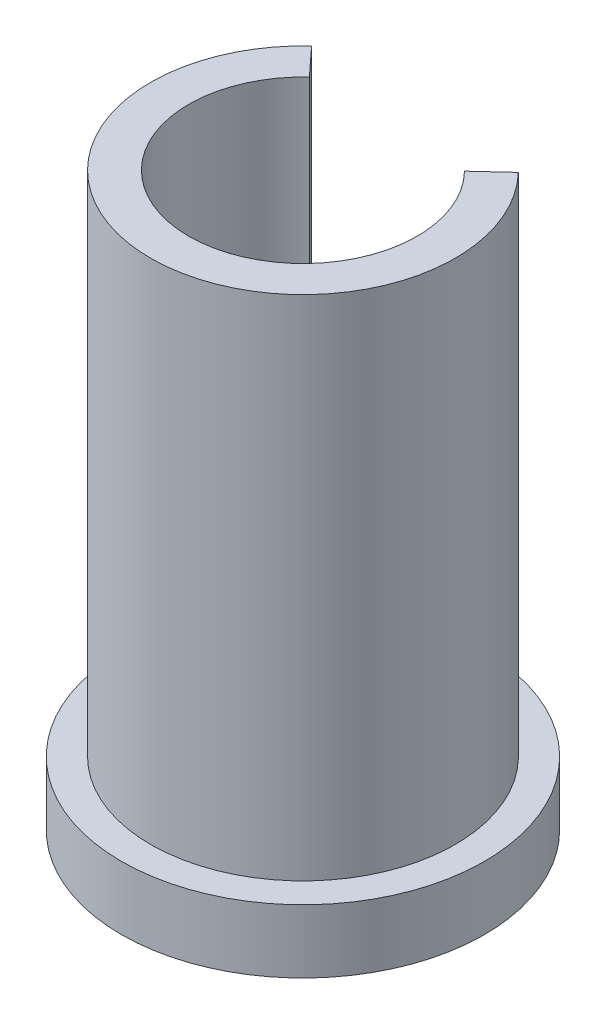
ISO-10303-21;
HEADER;
FILE_DESCRIPTION(('STEP AP214'),'2;1');
FILE_NAME('part.step','',(''),(''),'','','');
FILE_SCHEMA(('AUTOMOTIVE_DESIGN { 1 0 10303 214 1 1 1 1 }'));
ENDSEC;
DATA;
#1=APPLICATION_CONTEXT('core data for automotive mechanical design processes');
#2=APPLICATION_PROTOCOL_DEFINITION('international standard','automotive_design',2000,#1);
#3=PRODUCT_CONTEXT('',#1,'mechanical');
#4=PRODUCT('Part','Part','',(#3));
#5=PRODUCT_RELATED_PRODUCT_CATEGORY('part','',(#4));
#6=PRODUCT_DEFINITION_FORMATION('','',#4);
#7=PRODUCT_DEFINITION_CONTEXT('part definition',#1,'design');
#8=PRODUCT_DEFINITION('design','',#6,#7);
#9=PRODUCT_DEFINITION_SHAPE('','',#8);
#10=(LENGTH_UNIT() NAMED_UNIT(*) SI_UNIT(.MILLI.,.METRE.));
#11=(NAMED_UNIT(*) PLANE_ANGLE_UNIT() SI_UNIT($,.RADIAN.));
#12=(NAMED_UNIT(*) SI_UNIT($,.STERADIAN.) SOLID_ANGLE_UNIT());
#13=UNCERTAINTY_MEASURE_WITH_UNIT(LENGTH_MEASURE(1.E-05),#10,'distance_accuracy_value','');
#14=(GEOMETRIC_REPRESENTATION_CONTEXT(3) GLOBAL_UNCERTAINTY_ASSIGNED_CONTEXT((#13)) GLOBAL_UNIT_ASSIGNED_CONTEXT((#10,
#11,#12)) REPRESENTATION_CONTEXT('',''));
#15=CARTESIAN_POINT('',(0.,0.,0.));
#16=DIRECTION('',(0.,0.,1.));
#17=DIRECTION('',(1.,0.,0.));
#18=AXIS2_PLACEMENT_3D('',#15,#16,#17);
#19=CARTESIAN_POINT('',(0.,5.,0.));
#20=DIRECTION('',(0.,-1.,0.));
#21=DIRECTION('',(0.,0.,-1.));
#22=AXIS2_PLACEMENT_3D('',#19,#20,#21);
#23=CYLINDRICAL_SURFACE('',#22,14.3);
#24=CARTESIAN_POINT('',(0.,5.,0.));
#25=DIRECTION('',(0.,1.,0.));
#26=DIRECTION('',(0.,0.,1.));
#27=AXIS2_PLACEMENT_3D('',#24,#25,#26);
#28=CIRCLE('',#27,14.3);
#29=CARTESIAN_POINT('',(0.,5.,14.3));
#30=VERTEX_POINT('',#29);
#31=EDGE_CURVE('E107',#30,#30,#28,.T.);
#32=ORIENTED_EDGE('',*,*,#31,.F.);
#33=EDGE_LOOP('',(#32));
#34=FACE_BOUND('',#33,.T.);
#35=CARTESIAN_POINT('',(0.,0.,0.));
#36=DIRECTION('',(0.,1.,0.));
#37=DIRECTION('',(0.,0.,1.));
#38=AXIS2_PLACEMENT_3D('',#35,#36,#37);
#39=CIRCLE('',#38,14.3);
#40=CARTESIAN_POINT('',(0.,0.,14.3));
#41=VERTEX_POINT('',#40);
#42=EDGE_CURVE('E101',#41,#41,#39,.T.);
#43=ORIENTED_EDGE('',*,*,#42,.T.);
#44=EDGE_LOOP('',(#43));
#45=FACE_BOUND('',#44,.T.);
#46=ADVANCED_FACE('F39',(#34,#45),#23,.T.);
#47=CARTESIAN_POINT('',(0.,5.,0.));
#48=DIRECTION('',(0.,1.,0.));
#49=DIRECTION('',(0.,0.,1.));
#50=AXIS2_PLACEMENT_3D('',#47,#48,#49);
#51=PLANE('',#50);
#52=DIRECTION('',(0.73476571107255,0.,-0.678320978469669));
#53=VECTOR('',#52,1.);
#54=CARTESIAN_POINT('',(2.34020737572036,5.,-2.5349417032003));
#55=LINE('',#54,#53);
#56=CARTESIAN_POINT('',(6.42314169348635,5.,-6.30422483620289));
#57=VERTEX_POINT('',#56);
#58=CARTESIAN_POINT('',(8.62821199462002,5.,-8.33990154473632));
#59=VERTEX_POINT('',#58);
#60=EDGE_CURVE('E85',#57,#59,#55,.T.);
#61=ORIENTED_EDGE('',*,*,#60,.T.);
#62=CARTESIAN_POINT('',(0.,5.,0.));
#63=DIRECTION('',(0.,1.,0.));
#64=DIRECTION('',(0.,0.,1.));
#65=AXIS2_PLACEMENT_3D('',#62,#63,#64);
#66=CIRCLE('',#65,12.);
#67=CARTESIAN_POINT('',(-8.13985174163603,5.,-8.81718853287061));
#68=VERTEX_POINT('',#67);
#69=EDGE_CURVE('E113',#68,#59,#66,.T.);
#70=ORIENTED_EDGE('',*,*,#69,.F.);
#71=DIRECTION('',(0.678320978469669,0.,0.734765711072551));
#72=VECTOR('',#71,1.);
#73=CARTESIAN_POINT('',(-8.84235087921134,5.,-9.57814432626637));
#74=LINE('',#73,#72);
#75=CARTESIAN_POINT('',(-6.10488880622702,5.,-6.61289139965295));
#76=VERTEX_POINT('',#75);
#77=EDGE_CURVE('E54',#68,#76,#74,.T.);
#78=ORIENTED_EDGE('',*,*,#77,.T.);
#79=CARTESIAN_POINT('',(0.,5.,0.));
#80=DIRECTION('',(0.,1.,0.));
#81=DIRECTION('',(0.,0.,1.));
#82=AXIS2_PLACEMENT_3D('',#79,#80,#81);
#83=CIRCLE('',#82,9.);
#84=EDGE_CURVE('E116',#76,#57,#83,.F.);
#85=ORIENTED_EDGE('',*,*,#84,.T.);
#86=EDGE_LOOP('',(#61,#70,#78,#85));
#87=FACE_BOUND('',#86,.T.);
#88=ORIENTED_EDGE('',*,*,#31,.T.);
#89=EDGE_LOOP('',(#88));
#90=FACE_BOUND('',#89,.T.);
#91=ADVANCED_FACE('F128',(#87,#90),#51,.T.);
#92=CARTESIAN_POINT('',(0.,0.,0.));
#93=DIRECTION('',(0.,1.,0.));
#94=DIRECTION('',(0.,0.,1.));
#95=AXIS2_PLACEMENT_3D('',#92,#93,#94);
#96=PLANE('',#95);
#97=CARTESIAN_POINT('',(0.,0.,0.));
#98=DIRECTION('',(0.,1.,0.));
#99=DIRECTION('',(0.,0.,1.));
#100=AXIS2_PLACEMENT_3D('',#97,#98,#99);
#101=CIRCLE('',#100,9.);
#102=CARTESIAN_POINT('',(0.,0.,9.));
#103=VERTEX_POINT('',#102);
#104=EDGE_CURVE('E102',#103,#103,#101,.T.);
#105=ORIENTED_EDGE('',*,*,#104,.T.);
#106=EDGE_LOOP('',(#105));
#107=FACE_BOUND('',#106,.T.);
#108=ORIENTED_EDGE('',*,*,#42,.F.);
#109=EDGE_LOOP('',(#108));
#110=FACE_BOUND('',#109,.T.);
#111=ADVANCED_FACE('F154',(#107,#110),#96,.F.);
#112=CARTESIAN_POINT('',(0.,45.,0.));
#113=DIRECTION('',(0.,-1.,0.));
#114=DIRECTION('',(0.,0.,-1.));
#115=AXIS2_PLACEMENT_3D('',#112,#113,#114);
#116=CYLINDRICAL_SURFACE('',#115,12.);
#117=DIRECTION('',(0.,-1.,0.));
#118=VECTOR('',#117,1.);
#119=CARTESIAN_POINT('',(8.62821199462002,45.,-8.33990154473632));
#120=LINE('',#119,#118);
#121=CARTESIAN_POINT('',(8.62821199462002,45.,-8.33990154473633));
#122=VERTEX_POINT('',#121);
#123=EDGE_CURVE('E84',#122,#59,#120,.T.);
#124=ORIENTED_EDGE('',*,*,#123,.F.);
#125=CARTESIAN_POINT('',(0.,45.,0.));
#126=DIRECTION('',(0.,-1.,0.));
#127=DIRECTION('',(0.,0.,-1.));
#128=AXIS2_PLACEMENT_3D('',#125,#126,#127);
#129=CIRCLE('',#128,12.);
#130=CARTESIAN_POINT('',(-8.13985174163603,45.,-8.81718853287061));
#131=VERTEX_POINT('',#130);
#132=EDGE_CURVE('E92',#122,#131,#129,.T.);
#133=ORIENTED_EDGE('',*,*,#132,.T.);
#134=DIRECTION('',(0.,-1.,0.));
#135=VECTOR('',#134,1.);
#136=CARTESIAN_POINT('',(-8.13985174163603,45.,-8.81718853287061));
#137=LINE('',#136,#135);
#138=EDGE_CURVE('E75',#68,#131,#137,.F.);
#139=ORIENTED_EDGE('',*,*,#138,.F.);
#140=ORIENTED_EDGE('',*,*,#69,.T.);
#141=EDGE_LOOP('',(#124,#133,#139,#140));
#142=FACE_BOUND('',#141,.T.);
#143=ADVANCED_FACE('F99',(#142),#116,.T.);
#144=CARTESIAN_POINT('',(0.,45.,0.));
#145=DIRECTION('',(0.,-1.,0.));
#146=DIRECTION('',(0.,0.,-1.));
#147=AXIS2_PLACEMENT_3D('',#144,#145,#146);
#148=PLANE('',#147);
#149=ORIENTED_EDGE('',*,*,#132,.F.);
#150=DIRECTION('',(0.73476571107255,0.,-0.678320978469669));
#151=VECTOR('',#150,1.);
#152=CARTESIAN_POINT('',(2.34020737572036,45.,-2.5349417032003));
#153=LINE('',#152,#151);
#154=CARTESIAN_POINT('',(6.42314169348635,45.,-6.30422483620289));
#155=VERTEX_POINT('',#154);
#156=EDGE_CURVE('E96',#155,#122,#153,.T.);
#157=ORIENTED_EDGE('',*,*,#156,.F.);
#158=CARTESIAN_POINT('',(0.,45.,0.));
#159=DIRECTION('',(0.,1.,0.));
#160=DIRECTION('',(0.,0.,1.));
#161=AXIS2_PLACEMENT_3D('',#158,#159,#160);
#162=CIRCLE('',#161,9.);
#163=CARTESIAN_POINT('',(-6.10488880622702,45.,-6.61289139965295));
#164=VERTEX_POINT('',#163);
#165=EDGE_CURVE('E94',#164,#155,#162,.T.);
#166=ORIENTED_EDGE('',*,*,#165,.F.);
#167=DIRECTION('',(0.678320978469669,0.,0.734765711072551));
#168=VECTOR('',#167,1.);
#169=CARTESIAN_POINT('',(-8.84235087921134,45.,-9.57814432626637));
#170=LINE('',#169,#168);
#171=EDGE_CURVE('E78',#131,#164,#170,.T.);
#172=ORIENTED_EDGE('',*,*,#171,.F.);
#173=EDGE_LOOP('',(#149,#157,#166,#172));
#174=FACE_BOUND('',#173,.T.);
#175=ADVANCED_FACE('F90',(#174),#148,.F.);
#176=CARTESIAN_POINT('',(0.,0.,0.));
#177=DIRECTION('',(0.,1.,0.));
#178=DIRECTION('',(0.,0.,1.));
#179=AXIS2_PLACEMENT_3D('',#176,#177,#178);
#180=CYLINDRICAL_SURFACE('',#179,9.);
#181=ORIENTED_EDGE('',*,*,#165,.T.);
#182=DIRECTION('',(0.,1.,0.));
#183=VECTOR('',#182,1.);
#184=CARTESIAN_POINT('',(6.42314169348635,0.,-6.30422483620289));
#185=LINE('',#184,#183);
#186=EDGE_CURVE('E11',#155,#57,#185,.F.);
#187=ORIENTED_EDGE('',*,*,#186,.T.);
#188=ORIENTED_EDGE('',*,*,#84,.F.);
#189=DIRECTION('',(0.,1.,0.));
#190=VECTOR('',#189,1.);
#191=CARTESIAN_POINT('',(-6.10488880622702,0.,-6.61289139965295));
#192=LINE('',#191,#190);
#193=EDGE_CURVE('E47',#76,#164,#192,.T.);
#194=ORIENTED_EDGE('',*,*,#193,.T.);
#195=EDGE_LOOP('',(#181,#187,#188,#194));
#196=FACE_BOUND('',#195,.T.);
#197=ORIENTED_EDGE('',*,*,#104,.F.);
#198=EDGE_LOOP('',(#197));
#199=FACE_BOUND('',#198,.T.);
#200=ADVANCED_FACE('F124',(#196,#199),#180,.F.);
#201=CARTESIAN_POINT('',(2.34020737572036,5.,-2.5349417032003));
#202=DIRECTION('',(0.678320978469669,0.,0.73476571107255));
#203=DIRECTION('',(0.73476571107255,0.,-0.678320978469669));
#204=AXIS2_PLACEMENT_3D('',#201,#202,#203);
#205=PLANE('',#204);
#206=ORIENTED_EDGE('',*,*,#123,.T.);
#207=ORIENTED_EDGE('',*,*,#60,.F.);
#208=ORIENTED_EDGE('',*,*,#186,.F.);
#209=ORIENTED_EDGE('',*,*,#156,.T.);
#210=EDGE_LOOP('',(#206,#207,#208,#209));
#211=FACE_BOUND('',#210,.T.);
#212=ADVANCED_FACE('F131',(#211),#205,.F.);
#213=CARTESIAN_POINT('',(-8.84235087921134,5.,-9.57814432626637));
#214=DIRECTION('',(-0.734765711072551,0.,0.678320978469669));
#215=DIRECTION('',(0.678320978469669,0.,0.734765711072551));
#216=AXIS2_PLACEMENT_3D('',#213,#214,#215);
#217=PLANE('',#216);
#218=ORIENTED_EDGE('',*,*,#138,.T.);
#219=ORIENTED_EDGE('',*,*,#171,.T.);
#220=ORIENTED_EDGE('',*,*,#193,.F.);
#221=ORIENTED_EDGE('',*,*,#77,.F.);
#222=EDGE_LOOP('',(#218,#219,#220,#221));
#223=FACE_BOUND('',#222,.T.);
#224=ADVANCED_FACE('F77',(#223),#217,.F.);
#225=CLOSED_SHELL('',(#46,#91,#111,#143,#175,#200,#212,#224));
#226=MANIFOLD_SOLID_BREP('B2',#225);
#227=ADVANCED_BREP_SHAPE_REPRESENTATION('',(#18,#226),#14);
#228=SHAPE_DEFINITION_REPRESENTATION(#9,#227);
ENDSEC;
END-ISO-10303-21;
